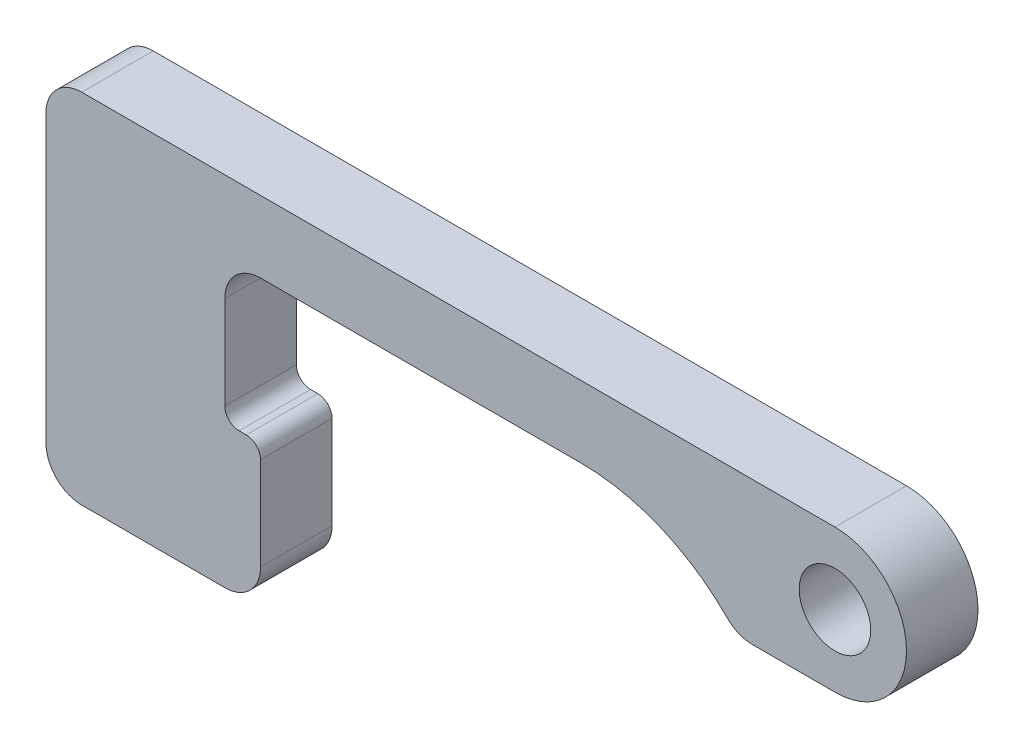
ISO-10303-21;
HEADER;
FILE_DESCRIPTION(('STEP AP214'),'2;1');
FILE_NAME('part.step','',(''),(''),'','','');
FILE_SCHEMA(('AUTOMOTIVE_DESIGN { 1 0 10303 214 1 1 1 1 }'));
ENDSEC;
DATA;
#1=APPLICATION_CONTEXT('core data for automotive mechanical design processes');
#2=APPLICATION_PROTOCOL_DEFINITION('international standard','automotive_design',2000,#1);
#3=PRODUCT_CONTEXT('',#1,'mechanical');
#4=PRODUCT('Part','Part','',(#3));
#5=PRODUCT_RELATED_PRODUCT_CATEGORY('part','',(#4));
#6=PRODUCT_DEFINITION_FORMATION('','',#4);
#7=PRODUCT_DEFINITION_CONTEXT('part definition',#1,'design');
#8=PRODUCT_DEFINITION('design','',#6,#7);
#9=PRODUCT_DEFINITION_SHAPE('','',#8);
#10=(LENGTH_UNIT() NAMED_UNIT(*) SI_UNIT(.MILLI.,.METRE.));
#11=(NAMED_UNIT(*) PLANE_ANGLE_UNIT() SI_UNIT($,.RADIAN.));
#12=(NAMED_UNIT(*) SI_UNIT($,.STERADIAN.) SOLID_ANGLE_UNIT());
#13=UNCERTAINTY_MEASURE_WITH_UNIT(LENGTH_MEASURE(1.E-05),#10,'distance_accuracy_value','');
#14=(GEOMETRIC_REPRESENTATION_CONTEXT(3) GLOBAL_UNCERTAINTY_ASSIGNED_CONTEXT((#13)) GLOBAL_UNIT_ASSIGNED_CONTEXT((#10,
#11,#12)) REPRESENTATION_CONTEXT('',''));
#15=CARTESIAN_POINT('',(0.,0.,0.));
#16=DIRECTION('',(0.,0.,1.));
#17=DIRECTION('',(1.,0.,0.));
#18=AXIS2_PLACEMENT_3D('',#15,#16,#17);
#19=CARTESIAN_POINT('',(0.,0.,-10.));
#20=DIRECTION('',(0.,0.,-1.));
#21=DIRECTION('',(1.,0.,0.));
#22=AXIS2_PLACEMENT_3D('',#19,#20,#21);
#23=PLANE('',#22);
#24=DIRECTION('',(0.,1.,0.));
#25=VECTOR('',#24,1.);
#26=CARTESIAN_POINT('',(-80.3169457006491,-20.,-10.));
#27=LINE('',#26,#25);
#28=CARTESIAN_POINT('',(-80.3169457006491,-35.,-10.));
#29=VERTEX_POINT('',#28);
#30=CARTESIAN_POINT('',(-80.3169457006491,-22.,-10.));
#31=VERTEX_POINT('',#30);
#32=EDGE_CURVE('E232',#29,#31,#27,.T.);
#33=ORIENTED_EDGE('',*,*,#32,.F.);
#34=CARTESIAN_POINT('',(-85.3169457006491,-35.,-10.));
#35=DIRECTION('',(0.,0.,1.));
#36=DIRECTION('',(1.,0.,0.));
#37=AXIS2_PLACEMENT_3D('',#34,#35,#36);
#38=CIRCLE('',#37,5.);
#39=CARTESIAN_POINT('',(-85.3169457006491,-40.,-10.));
#40=VERTEX_POINT('',#39);
#41=EDGE_CURVE('E257',#40,#29,#38,.T.);
#42=ORIENTED_EDGE('',*,*,#41,.F.);
#43=DIRECTION('',(1.,0.,0.));
#44=VECTOR('',#43,1.);
#45=CARTESIAN_POINT('',(-80.3169457006491,-40.,-10.));
#46=LINE('',#45,#44);
#47=CARTESIAN_POINT('',(-105.316945700649,-40.,-10.));
#48=VERTEX_POINT('',#47);
#49=EDGE_CURVE('E200',#48,#40,#46,.T.);
#50=ORIENTED_EDGE('',*,*,#49,.F.);
#51=CARTESIAN_POINT('',(-105.316945700649,-35.,-10.));
#52=DIRECTION('',(0.,0.,1.));
#53=DIRECTION('',(1.,0.,0.));
#54=AXIS2_PLACEMENT_3D('',#51,#52,#53);
#55=CIRCLE('',#54,5.);
#56=CARTESIAN_POINT('',(-110.316945700649,-35.,-10.));
#57=VERTEX_POINT('',#56);
#58=EDGE_CURVE('E254',#57,#48,#55,.T.);
#59=ORIENTED_EDGE('',*,*,#58,.F.);
#60=DIRECTION('',(0.,-1.,0.));
#61=VECTOR('',#60,1.);
#62=CARTESIAN_POINT('',(-110.316945700649,-40.,-10.));
#63=LINE('',#62,#61);
#64=CARTESIAN_POINT('',(-110.316945700649,4.99999999999999,-10.));
#65=VERTEX_POINT('',#64);
#66=EDGE_CURVE('E197',#65,#57,#63,.T.);
#67=ORIENTED_EDGE('',*,*,#66,.F.);
#68=CARTESIAN_POINT('',(-105.316945700649,5.,-10.));
#69=DIRECTION('',(0.,0.,1.));
#70=DIRECTION('',(1.,0.,0.));
#71=AXIS2_PLACEMENT_3D('',#68,#69,#70);
#72=CIRCLE('',#71,5.);
#73=CARTESIAN_POINT('',(-105.316945700649,10.,-10.));
#74=VERTEX_POINT('',#73);
#75=EDGE_CURVE('E260',#74,#65,#72,.T.);
#76=ORIENTED_EDGE('',*,*,#75,.F.);
#77=DIRECTION('',(-1.,0.,0.));
#78=VECTOR('',#77,1.);
#79=CARTESIAN_POINT('',(-110.316945700649,10.,-10.));
#80=LINE('',#79,#78);
#81=CARTESIAN_POINT('',(0.,10.,-10.));
#82=VERTEX_POINT('',#81);
#83=EDGE_CURVE('E194',#82,#74,#80,.T.);
#84=ORIENTED_EDGE('',*,*,#83,.F.);
#85=CARTESIAN_POINT('',(0.,0.,-10.));
#86=DIRECTION('',(0.,0.,1.));
#87=DIRECTION('',(1.,0.,0.));
#88=AXIS2_PLACEMENT_3D('',#85,#86,#87);
#89=CIRCLE('',#88,10.);
#90=CARTESIAN_POINT('',(0.,-10.,-10.));
#91=VERTEX_POINT('',#90);
#92=EDGE_CURVE('E188',#91,#82,#89,.T.);
#93=ORIENTED_EDGE('',*,*,#92,.F.);
#94=DIRECTION('',(1.,0.,0.));
#95=VECTOR('',#94,1.);
#96=CARTESIAN_POINT('',(0.,-10.,-10.));
#97=LINE('',#96,#95);
#98=CARTESIAN_POINT('',(-11.5243555424344,-10.,-10.));
#99=VERTEX_POINT('',#98);
#100=EDGE_CURVE('E185',#99,#91,#97,.T.);
#101=ORIENTED_EDGE('',*,*,#100,.F.);
#102=CARTESIAN_POINT('',(-11.5243555424344,-5.,-10.));
#103=DIRECTION('',(0.,0.,1.));
#104=DIRECTION('',(1.,0.,0.));
#105=AXIS2_PLACEMENT_3D('',#102,#103,#104);
#106=CIRCLE('',#105,5.);
#107=CARTESIAN_POINT('',(-15.0715952576336,-8.52378921090821,-10.));
#108=VERTEX_POINT('',#107);
#109=EDGE_CURVE('E184',#108,#99,#106,.T.);
#110=ORIENTED_EDGE('',*,*,#109,.F.);
#111=CARTESIAN_POINT('',(-35.5537132832868,-28.8705016718932,-10.));
#112=DIRECTION('',(0.,0.,-1.));
#113=DIRECTION('',(1.,0.,0.));
#114=AXIS2_PLACEMENT_3D('',#111,#112,#113);
#115=CIRCLE('',#114,28.8705016718932);
#116=CARTESIAN_POINT('',(-35.5537132832868,0.,-10.));
#117=VERTEX_POINT('',#116);
#118=EDGE_CURVE('E162',#117,#108,#115,.T.);
#119=ORIENTED_EDGE('',*,*,#118,.F.);
#120=DIRECTION('',(1.,0.,0.));
#121=VECTOR('',#120,1.);
#122=CARTESIAN_POINT('',(-85.3169457006491,0.,-10.));
#123=LINE('',#122,#121);
#124=CARTESIAN_POINT('',(-80.3169457006491,0.,-10.));
#125=VERTEX_POINT('',#124);
#126=EDGE_CURVE('E173',#125,#117,#123,.T.);
#127=ORIENTED_EDGE('',*,*,#126,.F.);
#128=CARTESIAN_POINT('',(-80.3169457006491,-4.99999999999999,-10.));
#129=DIRECTION('',(0.,0.,1.));
#130=DIRECTION('',(1.,0.,0.));
#131=AXIS2_PLACEMENT_3D('',#128,#129,#130);
#132=CIRCLE('',#131,5.);
#133=CARTESIAN_POINT('',(-85.3169457006491,-4.99999999999999,-10.));
#134=VERTEX_POINT('',#133);
#135=EDGE_CURVE('E279',#134,#125,#132,.F.);
#136=ORIENTED_EDGE('',*,*,#135,.F.);
#137=DIRECTION('',(0.,1.,0.));
#138=VECTOR('',#137,1.);
#139=CARTESIAN_POINT('',(-85.3169457006491,0.,-10.));
#140=LINE('',#139,#138);
#141=CARTESIAN_POINT('',(-85.3169457006491,-18.,-10.));
#142=VERTEX_POINT('',#141);
#143=EDGE_CURVE('E178',#142,#134,#140,.T.);
#144=ORIENTED_EDGE('',*,*,#143,.F.);
#145=CARTESIAN_POINT('',(-83.3169457006491,-18.,-10.));
#146=DIRECTION('',(0.,0.,1.));
#147=DIRECTION('',(1.,0.,0.));
#148=AXIS2_PLACEMENT_3D('',#145,#146,#147);
#149=CIRCLE('',#148,2.);
#150=CARTESIAN_POINT('',(-83.3169457006491,-20.,-10.));
#151=VERTEX_POINT('',#150);
#152=EDGE_CURVE('E11',#151,#142,#149,.F.);
#153=ORIENTED_EDGE('',*,*,#152,.F.);
#154=DIRECTION('',(-1.,0.,0.));
#155=VECTOR('',#154,1.);
#156=CARTESIAN_POINT('',(-85.3169457006491,-20.,-10.));
#157=LINE('',#156,#155);
#158=CARTESIAN_POINT('',(-82.3169457006491,-20.,-10.));
#159=VERTEX_POINT('',#158);
#160=EDGE_CURVE('E305',#159,#151,#157,.T.);
#161=ORIENTED_EDGE('',*,*,#160,.F.);
#162=CARTESIAN_POINT('',(-82.3169457006491,-22.,-10.));
#163=DIRECTION('',(0.,0.,1.));
#164=DIRECTION('',(1.,0.,0.));
#165=AXIS2_PLACEMENT_3D('',#162,#163,#164);
#166=CIRCLE('',#165,2.);
#167=EDGE_CURVE('E290',#31,#159,#166,.T.);
#168=ORIENTED_EDGE('',*,*,#167,.F.);
#169=EDGE_LOOP('',(#33,#42,#50,#59,#67,#76,#84,#93,#101,#110,#119,#127,#136,#144,#153,#161,#168));
#170=FACE_BOUND('',#169,.T.);
#171=CARTESIAN_POINT('',(0.,0.,-10.));
#172=DIRECTION('',(0.,0.,1.));
#173=DIRECTION('',(1.,0.,0.));
#174=AXIS2_PLACEMENT_3D('',#171,#172,#173);
#175=CIRCLE('',#174,4.99999999999999);
#176=CARTESIAN_POINT('',(4.99999999999999,0.,-10.));
#177=VERTEX_POINT('',#176);
#178=EDGE_CURVE('E208',#177,#177,#175,.T.);
#179=ORIENTED_EDGE('',*,*,#178,.T.);
#180=EDGE_LOOP('',(#179));
#181=FACE_BOUND('',#180,.T.);
#182=ADVANCED_FACE('F39',(#170,#181),#23,.T.);
#183=CARTESIAN_POINT('',(0.,0.,0.));
#184=DIRECTION('',(0.,0.,-1.));
#185=DIRECTION('',(1.,0.,0.));
#186=AXIS2_PLACEMENT_3D('',#183,#184,#185);
#187=PLANE('',#186);
#188=DIRECTION('',(-1.,0.,0.));
#189=VECTOR('',#188,1.);
#190=CARTESIAN_POINT('',(-85.3169457006491,-20.,0.));
#191=LINE('',#190,#189);
#192=CARTESIAN_POINT('',(-82.3169457006491,-20.,0.));
#193=VERTEX_POINT('',#192);
#194=CARTESIAN_POINT('',(-83.3169457006491,-20.,0.));
#195=VERTEX_POINT('',#194);
#196=EDGE_CURVE('E207',#193,#195,#191,.T.);
#197=ORIENTED_EDGE('',*,*,#196,.T.);
#198=CARTESIAN_POINT('',(-83.3169457006491,-18.,0.));
#199=DIRECTION('',(0.,0.,1.));
#200=DIRECTION('',(1.,0.,0.));
#201=AXIS2_PLACEMENT_3D('',#198,#199,#200);
#202=CIRCLE('',#201,2.);
#203=CARTESIAN_POINT('',(-85.3169457006491,-18.,0.));
#204=VERTEX_POINT('',#203);
#205=EDGE_CURVE('E47',#204,#195,#202,.T.);
#206=ORIENTED_EDGE('',*,*,#205,.F.);
#207=DIRECTION('',(0.,1.,0.));
#208=VECTOR('',#207,1.);
#209=CARTESIAN_POINT('',(-85.3169457006491,0.,0.));
#210=LINE('',#209,#208);
#211=CARTESIAN_POINT('',(-85.3169457006491,-4.99999999999999,0.));
#212=VERTEX_POINT('',#211);
#213=EDGE_CURVE('E211',#204,#212,#210,.T.);
#214=ORIENTED_EDGE('',*,*,#213,.T.);
#215=CARTESIAN_POINT('',(-80.3169457006491,-4.99999999999999,0.));
#216=DIRECTION('',(0.,0.,1.));
#217=DIRECTION('',(1.,0.,0.));
#218=AXIS2_PLACEMENT_3D('',#215,#216,#217);
#219=CIRCLE('',#218,5.);
#220=CARTESIAN_POINT('',(-80.3169457006491,0.,0.));
#221=VERTEX_POINT('',#220);
#222=EDGE_CURVE('E276',#221,#212,#219,.T.);
#223=ORIENTED_EDGE('',*,*,#222,.F.);
#224=DIRECTION('',(1.,0.,0.));
#225=VECTOR('',#224,1.);
#226=CARTESIAN_POINT('',(-85.3169457006491,0.,0.));
#227=LINE('',#226,#225);
#228=CARTESIAN_POINT('',(-35.5537132832868,0.,0.));
#229=VERTEX_POINT('',#228);
#230=EDGE_CURVE('E214',#221,#229,#227,.T.);
#231=ORIENTED_EDGE('',*,*,#230,.T.);
#232=CARTESIAN_POINT('',(-35.5537132832868,-28.8705016718932,0.));
#233=DIRECTION('',(0.,0.,-1.));
#234=DIRECTION('',(1.,0.,0.));
#235=AXIS2_PLACEMENT_3D('',#232,#233,#234);
#236=CIRCLE('',#235,28.8705016718932);
#237=CARTESIAN_POINT('',(-15.0715952576336,-8.52378921090821,0.));
#238=VERTEX_POINT('',#237);
#239=EDGE_CURVE('E165',#229,#238,#236,.T.);
#240=ORIENTED_EDGE('',*,*,#239,.T.);
#241=CARTESIAN_POINT('',(-11.5243555424344,-5.,0.));
#242=DIRECTION('',(0.,0.,1.));
#243=DIRECTION('',(1.,0.,0.));
#244=AXIS2_PLACEMENT_3D('',#241,#242,#243);
#245=CIRCLE('',#244,5.);
#246=CARTESIAN_POINT('',(-11.5243555424344,-10.,0.));
#247=VERTEX_POINT('',#246);
#248=EDGE_CURVE('E249',#247,#238,#245,.F.);
#249=ORIENTED_EDGE('',*,*,#248,.F.);
#250=DIRECTION('',(1.,0.,0.));
#251=VECTOR('',#250,1.);
#252=CARTESIAN_POINT('',(0.,-10.,0.));
#253=LINE('',#252,#251);
#254=CARTESIAN_POINT('',(0.,-10.,0.));
#255=VERTEX_POINT('',#254);
#256=EDGE_CURVE('E217',#247,#255,#253,.T.);
#257=ORIENTED_EDGE('',*,*,#256,.T.);
#258=CARTESIAN_POINT('',(0.,0.,0.));
#259=DIRECTION('',(0.,0.,1.));
#260=DIRECTION('',(1.,0.,0.));
#261=AXIS2_PLACEMENT_3D('',#258,#259,#260);
#262=CIRCLE('',#261,10.);
#263=CARTESIAN_POINT('',(0.,10.,0.));
#264=VERTEX_POINT('',#263);
#265=EDGE_CURVE('E220',#255,#264,#262,.T.);
#266=ORIENTED_EDGE('',*,*,#265,.T.);
#267=DIRECTION('',(-1.,0.,0.));
#268=VECTOR('',#267,1.);
#269=CARTESIAN_POINT('',(-110.316945700649,10.,0.));
#270=LINE('',#269,#268);
#271=CARTESIAN_POINT('',(-105.316945700649,10.,0.));
#272=VERTEX_POINT('',#271);
#273=EDGE_CURVE('E223',#264,#272,#270,.T.);
#274=ORIENTED_EDGE('',*,*,#273,.T.);
#275=CARTESIAN_POINT('',(-105.316945700649,5.,0.));
#276=DIRECTION('',(0.,0.,1.));
#277=DIRECTION('',(1.,0.,0.));
#278=AXIS2_PLACEMENT_3D('',#275,#276,#277);
#279=CIRCLE('',#278,5.);
#280=CARTESIAN_POINT('',(-110.316945700649,4.99999999999999,0.));
#281=VERTEX_POINT('',#280);
#282=EDGE_CURVE('E246',#281,#272,#279,.F.);
#283=ORIENTED_EDGE('',*,*,#282,.F.);
#284=DIRECTION('',(0.,-1.,0.));
#285=VECTOR('',#284,1.);
#286=CARTESIAN_POINT('',(-110.316945700649,-40.,0.));
#287=LINE('',#286,#285);
#288=CARTESIAN_POINT('',(-110.316945700649,-35.,0.));
#289=VERTEX_POINT('',#288);
#290=EDGE_CURVE('E226',#281,#289,#287,.T.);
#291=ORIENTED_EDGE('',*,*,#290,.T.);
#292=CARTESIAN_POINT('',(-105.316945700649,-35.,0.));
#293=DIRECTION('',(0.,0.,1.));
#294=DIRECTION('',(1.,0.,0.));
#295=AXIS2_PLACEMENT_3D('',#292,#293,#294);
#296=CIRCLE('',#295,5.);
#297=CARTESIAN_POINT('',(-105.316945700649,-40.,0.));
#298=VERTEX_POINT('',#297);
#299=EDGE_CURVE('E240',#298,#289,#296,.F.);
#300=ORIENTED_EDGE('',*,*,#299,.F.);
#301=DIRECTION('',(1.,0.,0.));
#302=VECTOR('',#301,1.);
#303=CARTESIAN_POINT('',(-80.3169457006491,-40.,0.));
#304=LINE('',#303,#302);
#305=CARTESIAN_POINT('',(-85.3169457006491,-40.,0.));
#306=VERTEX_POINT('',#305);
#307=EDGE_CURVE('E229',#298,#306,#304,.T.);
#308=ORIENTED_EDGE('',*,*,#307,.T.);
#309=CARTESIAN_POINT('',(-85.3169457006491,-35.,0.));
#310=DIRECTION('',(0.,0.,1.));
#311=DIRECTION('',(1.,0.,0.));
#312=AXIS2_PLACEMENT_3D('',#309,#310,#311);
#313=CIRCLE('',#312,5.);
#314=CARTESIAN_POINT('',(-80.3169457006491,-35.,0.));
#315=VERTEX_POINT('',#314);
#316=EDGE_CURVE('E243',#315,#306,#313,.F.);
#317=ORIENTED_EDGE('',*,*,#316,.F.);
#318=DIRECTION('',(0.,1.,0.));
#319=VECTOR('',#318,1.);
#320=CARTESIAN_POINT('',(-80.3169457006491,-20.,0.));
#321=LINE('',#320,#319);
#322=CARTESIAN_POINT('',(-80.3169457006491,-22.,0.));
#323=VERTEX_POINT('',#322);
#324=EDGE_CURVE('E204',#315,#323,#321,.T.);
#325=ORIENTED_EDGE('',*,*,#324,.T.);
#326=CARTESIAN_POINT('',(-82.3169457006491,-22.,0.));
#327=DIRECTION('',(0.,0.,1.));
#328=DIRECTION('',(1.,0.,0.));
#329=AXIS2_PLACEMENT_3D('',#326,#327,#328);
#330=CIRCLE('',#329,2.);
#331=EDGE_CURVE('E287',#193,#323,#330,.F.);
#332=ORIENTED_EDGE('',*,*,#331,.F.);
#333=EDGE_LOOP('',(#197,#206,#214,#223,#231,#240,#249,#257,#266,#274,#283,#291,#300,#308,#317,
#325,#332));
#334=FACE_BOUND('',#333,.T.);
#335=CARTESIAN_POINT('',(0.,0.,0.));
#336=DIRECTION('',(0.,0.,1.));
#337=DIRECTION('',(1.,0.,0.));
#338=AXIS2_PLACEMENT_3D('',#335,#336,#337);
#339=CIRCLE('',#338,4.99999999999999);
#340=CARTESIAN_POINT('',(4.99999999999999,0.,0.));
#341=VERTEX_POINT('',#340);
#342=EDGE_CURVE('E313',#341,#341,#339,.T.);
#343=ORIENTED_EDGE('',*,*,#342,.F.);
#344=EDGE_LOOP('',(#343));
#345=FACE_BOUND('',#344,.T.);
#346=ADVANCED_FACE('F300',(#334,#345),#187,.F.);
#347=CARTESIAN_POINT('',(-80.3169457006491,-20.,-10.));
#348=DIRECTION('',(-1.,0.,0.));
#349=DIRECTION('',(0.,0.,-1.));
#350=AXIS2_PLACEMENT_3D('',#347,#348,#349);
#351=PLANE('',#350);
#352=ORIENTED_EDGE('',*,*,#324,.F.);
#353=DIRECTION('',(0.,0.,1.));
#354=VECTOR('',#353,1.);
#355=CARTESIAN_POINT('',(-80.3169457006491,-35.,-10.));
#356=LINE('',#355,#354);
#357=EDGE_CURVE('E270',#29,#315,#356,.T.);
#358=ORIENTED_EDGE('',*,*,#357,.F.);
#359=ORIENTED_EDGE('',*,*,#32,.T.);
#360=DIRECTION('',(0.,0.,1.));
#361=VECTOR('',#360,1.);
#362=CARTESIAN_POINT('',(-80.3169457006491,-22.,-10.));
#363=LINE('',#362,#361);
#364=EDGE_CURVE('E54',#323,#31,#363,.F.);
#365=ORIENTED_EDGE('',*,*,#364,.F.);
#366=EDGE_LOOP('',(#352,#358,#359,#365));
#367=FACE_BOUND('',#366,.T.);
#368=ADVANCED_FACE('F327',(#367),#351,.F.);
#369=CARTESIAN_POINT('',(-85.3169457006491,-20.,-10.));
#370=DIRECTION('',(0.,-1.,0.));
#371=DIRECTION('',(0.,0.,1.));
#372=AXIS2_PLACEMENT_3D('',#369,#370,#371);
#373=PLANE('',#372);
#374=ORIENTED_EDGE('',*,*,#196,.F.);
#375=DIRECTION('',(0.,0.,1.));
#376=VECTOR('',#375,1.);
#377=CARTESIAN_POINT('',(-82.3169457006491,-20.,-10.));
#378=LINE('',#377,#376);
#379=EDGE_CURVE('E283',#159,#193,#378,.T.);
#380=ORIENTED_EDGE('',*,*,#379,.F.);
#381=ORIENTED_EDGE('',*,*,#160,.T.);
#382=DIRECTION('',(0.,0.,1.));
#383=VECTOR('',#382,1.);
#384=CARTESIAN_POINT('',(-83.3169457006491,-20.,-10.));
#385=LINE('',#384,#383);
#386=EDGE_CURVE('E285',#195,#151,#385,.F.);
#387=ORIENTED_EDGE('',*,*,#386,.F.);
#388=EDGE_LOOP('',(#374,#380,#381,#387));
#389=FACE_BOUND('',#388,.T.);
#390=ADVANCED_FACE('F303',(#389),#373,.F.);
#391=CARTESIAN_POINT('',(-85.3169457006491,0.,-10.));
#392=DIRECTION('',(-1.,0.,0.));
#393=DIRECTION('',(0.,0.,-1.));
#394=AXIS2_PLACEMENT_3D('',#391,#392,#393);
#395=PLANE('',#394);
#396=ORIENTED_EDGE('',*,*,#143,.T.);
#397=DIRECTION('',(0.,0.,1.));
#398=VECTOR('',#397,1.);
#399=CARTESIAN_POINT('',(-85.3169457006491,-4.99999999999999,-10.));
#400=LINE('',#399,#398);
#401=EDGE_CURVE('E236',#212,#134,#400,.F.);
#402=ORIENTED_EDGE('',*,*,#401,.F.);
#403=ORIENTED_EDGE('',*,*,#213,.F.);
#404=DIRECTION('',(0.,0.,1.));
#405=VECTOR('',#404,1.);
#406=CARTESIAN_POINT('',(-85.3169457006491,-18.,0.));
#407=LINE('',#406,#405);
#408=EDGE_CURVE('E281',#142,#204,#407,.T.);
#409=ORIENTED_EDGE('',*,*,#408,.F.);
#410=EDGE_LOOP('',(#396,#402,#403,#409));
#411=FACE_BOUND('',#410,.T.);
#412=ADVANCED_FACE('F359',(#411),#395,.F.);
#413=CARTESIAN_POINT('',(-85.3169457006491,0.,-10.));
#414=DIRECTION('',(0.,1.,0.));
#415=DIRECTION('',(0.,0.,-1.));
#416=AXIS2_PLACEMENT_3D('',#413,#414,#415);
#417=PLANE('',#416);
#418=ORIENTED_EDGE('',*,*,#126,.T.);
#419=DIRECTION('',(0.,0.,1.));
#420=VECTOR('',#419,1.);
#421=CARTESIAN_POINT('',(-35.5537132832868,0.,-10.));
#422=LINE('',#421,#420);
#423=EDGE_CURVE('E158',#117,#229,#422,.T.);
#424=ORIENTED_EDGE('',*,*,#423,.T.);
#425=ORIENTED_EDGE('',*,*,#230,.F.);
#426=DIRECTION('',(0.,0.,1.));
#427=VECTOR('',#426,1.);
#428=CARTESIAN_POINT('',(-80.3169457006491,0.,0.));
#429=LINE('',#428,#427);
#430=EDGE_CURVE('E169',#125,#221,#429,.T.);
#431=ORIENTED_EDGE('',*,*,#430,.F.);
#432=EDGE_LOOP('',(#418,#424,#425,#431));
#433=FACE_BOUND('',#432,.T.);
#434=ADVANCED_FACE('F174',(#433),#417,.F.);
#435=CARTESIAN_POINT('',(-35.5537132832868,-28.8705016718932,-10.));
#436=DIRECTION('',(0.,0.,1.));
#437=DIRECTION('',(-1.,0.,0.));
#438=AXIS2_PLACEMENT_3D('',#435,#436,#437);
#439=CYLINDRICAL_SURFACE('',#438,28.8705016718932);
#440=ORIENTED_EDGE('',*,*,#239,.F.);
#441=ORIENTED_EDGE('',*,*,#423,.F.);
#442=ORIENTED_EDGE('',*,*,#118,.T.);
#443=DIRECTION('',(0.,0.,1.));
#444=VECTOR('',#443,1.);
#445=CARTESIAN_POINT('',(-15.0715952576336,-8.52378921090822,-10.));
#446=LINE('',#445,#444);
#447=EDGE_CURVE('E252',#238,#108,#446,.F.);
#448=ORIENTED_EDGE('',*,*,#447,.F.);
#449=EDGE_LOOP('',(#440,#441,#442,#448));
#450=FACE_BOUND('',#449,.T.);
#451=ADVANCED_FACE('F160',(#450),#439,.F.);
#452=CARTESIAN_POINT('',(0.,-10.,-10.));
#453=DIRECTION('',(0.,1.,0.));
#454=DIRECTION('',(0.,0.,-1.));
#455=AXIS2_PLACEMENT_3D('',#452,#453,#454);
#456=PLANE('',#455);
#457=ORIENTED_EDGE('',*,*,#100,.T.);
#458=DIRECTION('',(0.,0.,1.));
#459=VECTOR('',#458,1.);
#460=CARTESIAN_POINT('',(0.,-10.,-10.));
#461=LINE('',#460,#459);
#462=EDGE_CURVE('E170',#91,#255,#461,.T.);
#463=ORIENTED_EDGE('',*,*,#462,.T.);
#464=ORIENTED_EDGE('',*,*,#256,.F.);
#465=DIRECTION('',(0.,0.,1.));
#466=VECTOR('',#465,1.);
#467=CARTESIAN_POINT('',(-11.5243555424344,-10.,-10.));
#468=LINE('',#467,#466);
#469=EDGE_CURVE('E238',#99,#247,#468,.T.);
#470=ORIENTED_EDGE('',*,*,#469,.F.);
#471=EDGE_LOOP('',(#457,#463,#464,#470));
#472=FACE_BOUND('',#471,.T.);
#473=ADVANCED_FACE('F350',(#472),#456,.F.);
#474=CARTESIAN_POINT('',(0.,0.,-10.));
#475=DIRECTION('',(0.,0.,1.));
#476=DIRECTION('',(-1.,0.,0.));
#477=AXIS2_PLACEMENT_3D('',#474,#475,#476);
#478=CYLINDRICAL_SURFACE('',#477,10.);
#479=ORIENTED_EDGE('',*,*,#265,.F.);
#480=ORIENTED_EDGE('',*,*,#462,.F.);
#481=ORIENTED_EDGE('',*,*,#92,.T.);
#482=DIRECTION('',(0.,0.,1.));
#483=VECTOR('',#482,1.);
#484=CARTESIAN_POINT('',(0.,10.,-10.));
#485=LINE('',#484,#483);
#486=EDGE_CURVE('E203',#82,#264,#485,.T.);
#487=ORIENTED_EDGE('',*,*,#486,.T.);
#488=EDGE_LOOP('',(#479,#480,#481,#487));
#489=FACE_BOUND('',#488,.T.);
#490=ADVANCED_FACE('F346',(#489),#478,.T.);
#491=CARTESIAN_POINT('',(-110.316945700649,10.,-10.));
#492=DIRECTION('',(0.,-1.,0.));
#493=DIRECTION('',(0.,0.,1.));
#494=AXIS2_PLACEMENT_3D('',#491,#492,#493);
#495=PLANE('',#494);
#496=ORIENTED_EDGE('',*,*,#273,.F.);
#497=ORIENTED_EDGE('',*,*,#486,.F.);
#498=ORIENTED_EDGE('',*,*,#83,.T.);
#499=DIRECTION('',(0.,0.,1.));
#500=VECTOR('',#499,1.);
#501=CARTESIAN_POINT('',(-105.316945700649,10.,-10.));
#502=LINE('',#501,#500);
#503=EDGE_CURVE('E268',#272,#74,#502,.F.);
#504=ORIENTED_EDGE('',*,*,#503,.F.);
#505=EDGE_LOOP('',(#496,#497,#498,#504));
#506=FACE_BOUND('',#505,.T.);
#507=ADVANCED_FACE('F342',(#506),#495,.F.);
#508=CARTESIAN_POINT('',(-110.316945700649,-40.,-10.));
#509=DIRECTION('',(1.,0.,0.));
#510=DIRECTION('',(0.,0.,1.));
#511=AXIS2_PLACEMENT_3D('',#508,#509,#510);
#512=PLANE('',#511);
#513=ORIENTED_EDGE('',*,*,#66,.T.);
#514=DIRECTION('',(0.,0.,1.));
#515=VECTOR('',#514,1.);
#516=CARTESIAN_POINT('',(-110.316945700649,-35.,-10.));
#517=LINE('',#516,#515);
#518=EDGE_CURVE('E264',#289,#57,#517,.F.);
#519=ORIENTED_EDGE('',*,*,#518,.F.);
#520=ORIENTED_EDGE('',*,*,#290,.F.);
#521=DIRECTION('',(0.,0.,1.));
#522=VECTOR('',#521,1.);
#523=CARTESIAN_POINT('',(-110.316945700649,5.,-10.));
#524=LINE('',#523,#522);
#525=EDGE_CURVE('E266',#65,#281,#524,.T.);
#526=ORIENTED_EDGE('',*,*,#525,.F.);
#527=EDGE_LOOP('',(#513,#519,#520,#526));
#528=FACE_BOUND('',#527,.T.);
#529=ADVANCED_FACE('F338',(#528),#512,.F.);
#530=CARTESIAN_POINT('',(-80.3169457006491,-40.,-10.));
#531=DIRECTION('',(0.,1.,0.));
#532=DIRECTION('',(0.,0.,-1.));
#533=AXIS2_PLACEMENT_3D('',#530,#531,#532);
#534=PLANE('',#533);
#535=ORIENTED_EDGE('',*,*,#307,.F.);
#536=DIRECTION('',(0.,0.,1.));
#537=VECTOR('',#536,1.);
#538=CARTESIAN_POINT('',(-105.316945700649,-40.,-10.));
#539=LINE('',#538,#537);
#540=EDGE_CURVE('E272',#48,#298,#539,.T.);
#541=ORIENTED_EDGE('',*,*,#540,.F.);
#542=ORIENTED_EDGE('',*,*,#49,.T.);
#543=DIRECTION('',(0.,0.,1.));
#544=VECTOR('',#543,1.);
#545=CARTESIAN_POINT('',(-85.3169457006491,-40.,-10.));
#546=LINE('',#545,#544);
#547=EDGE_CURVE('E274',#306,#40,#546,.F.);
#548=ORIENTED_EDGE('',*,*,#547,.F.);
#549=EDGE_LOOP('',(#535,#541,#542,#548));
#550=FACE_BOUND('',#549,.T.);
#551=ADVANCED_FACE('F323',(#550),#534,.F.);
#552=CARTESIAN_POINT('',(0.,0.,-10.));
#553=DIRECTION('',(0.,0.,1.));
#554=DIRECTION('',(-1.,0.,0.));
#555=AXIS2_PLACEMENT_3D('',#552,#553,#554);
#556=CYLINDRICAL_SURFACE('',#555,4.99999999999999);
#557=ORIENTED_EDGE('',*,*,#178,.F.);
#558=EDGE_LOOP('',(#557));
#559=FACE_BOUND('',#558,.T.);
#560=ORIENTED_EDGE('',*,*,#342,.T.);
#561=EDGE_LOOP('',(#560));
#562=FACE_BOUND('',#561,.T.);
#563=ADVANCED_FACE('F319',(#559,#562),#556,.F.);
#564=CARTESIAN_POINT('',(-80.3169457006491,-4.99999999999999,-10.));
#565=DIRECTION('',(0.,0.,-1.));
#566=DIRECTION('',(1.,0.,0.));
#567=AXIS2_PLACEMENT_3D('',#564,#565,#566);
#568=CYLINDRICAL_SURFACE('',#567,5.);
#569=ORIENTED_EDGE('',*,*,#135,.T.);
#570=ORIENTED_EDGE('',*,*,#430,.T.);
#571=ORIENTED_EDGE('',*,*,#222,.T.);
#572=ORIENTED_EDGE('',*,*,#401,.T.);
#573=EDGE_LOOP('',(#569,#570,#571,#572));
#574=FACE_BOUND('',#573,.T.);
#575=ADVANCED_FACE('F322',(#574),#568,.F.);
#576=CARTESIAN_POINT('',(-11.5243555424344,-5.,-10.));
#577=DIRECTION('',(0.,0.,1.));
#578=DIRECTION('',(-1.,0.,0.));
#579=AXIS2_PLACEMENT_3D('',#576,#577,#578);
#580=CYLINDRICAL_SURFACE('',#579,5.);
#581=ORIENTED_EDGE('',*,*,#109,.T.);
#582=ORIENTED_EDGE('',*,*,#469,.T.);
#583=ORIENTED_EDGE('',*,*,#248,.T.);
#584=ORIENTED_EDGE('',*,*,#447,.T.);
#585=EDGE_LOOP('',(#581,#582,#583,#584));
#586=FACE_BOUND('',#585,.T.);
#587=ADVANCED_FACE('F366',(#586),#580,.T.);
#588=CARTESIAN_POINT('',(-105.316945700649,5.,-10.));
#589=DIRECTION('',(0.,0.,1.));
#590=DIRECTION('',(-1.,0.,0.));
#591=AXIS2_PLACEMENT_3D('',#588,#589,#590);
#592=CYLINDRICAL_SURFACE('',#591,5.);
#593=ORIENTED_EDGE('',*,*,#75,.T.);
#594=ORIENTED_EDGE('',*,*,#525,.T.);
#595=ORIENTED_EDGE('',*,*,#282,.T.);
#596=ORIENTED_EDGE('',*,*,#503,.T.);
#597=EDGE_LOOP('',(#593,#594,#595,#596));
#598=FACE_BOUND('',#597,.T.);
#599=ADVANCED_FACE('F370',(#598),#592,.T.);
#600=CARTESIAN_POINT('',(-85.3169457006491,-35.,-10.));
#601=DIRECTION('',(0.,0.,1.));
#602=DIRECTION('',(-1.,0.,0.));
#603=AXIS2_PLACEMENT_3D('',#600,#601,#602);
#604=CYLINDRICAL_SURFACE('',#603,5.);
#605=ORIENTED_EDGE('',*,*,#41,.T.);
#606=ORIENTED_EDGE('',*,*,#357,.T.);
#607=ORIENTED_EDGE('',*,*,#316,.T.);
#608=ORIENTED_EDGE('',*,*,#547,.T.);
#609=EDGE_LOOP('',(#605,#606,#607,#608));
#610=FACE_BOUND('',#609,.T.);
#611=ADVANCED_FACE('F374',(#610),#604,.T.);
#612=CARTESIAN_POINT('',(-105.316945700649,-35.,-10.));
#613=DIRECTION('',(0.,0.,1.));
#614=DIRECTION('',(-1.,0.,0.));
#615=AXIS2_PLACEMENT_3D('',#612,#613,#614);
#616=CYLINDRICAL_SURFACE('',#615,5.);
#617=ORIENTED_EDGE('',*,*,#58,.T.);
#618=ORIENTED_EDGE('',*,*,#540,.T.);
#619=ORIENTED_EDGE('',*,*,#299,.T.);
#620=ORIENTED_EDGE('',*,*,#518,.T.);
#621=EDGE_LOOP('',(#617,#618,#619,#620));
#622=FACE_BOUND('',#621,.T.);
#623=ADVANCED_FACE('F378',(#622),#616,.T.);
#624=CARTESIAN_POINT('',(-83.3169457006491,-18.,-10.));
#625=DIRECTION('',(0.,0.,-1.));
#626=DIRECTION('',(1.,0.,0.));
#627=AXIS2_PLACEMENT_3D('',#624,#625,#626);
#628=CYLINDRICAL_SURFACE('',#627,2.);
#629=ORIENTED_EDGE('',*,*,#152,.T.);
#630=ORIENTED_EDGE('',*,*,#408,.T.);
#631=ORIENTED_EDGE('',*,*,#205,.T.);
#632=ORIENTED_EDGE('',*,*,#386,.T.);
#633=EDGE_LOOP('',(#629,#630,#631,#632));
#634=FACE_BOUND('',#633,.T.);
#635=ADVANCED_FACE('F294',(#634),#628,.F.);
#636=CARTESIAN_POINT('',(-82.3169457006491,-22.,-10.));
#637=DIRECTION('',(0.,0.,1.));
#638=DIRECTION('',(-1.,0.,0.));
#639=AXIS2_PLACEMENT_3D('',#636,#637,#638);
#640=CYLINDRICAL_SURFACE('',#639,2.);
#641=ORIENTED_EDGE('',*,*,#167,.T.);
#642=ORIENTED_EDGE('',*,*,#379,.T.);
#643=ORIENTED_EDGE('',*,*,#331,.T.);
#644=ORIENTED_EDGE('',*,*,#364,.T.);
#645=EDGE_LOOP('',(#641,#642,#643,#644));
#646=FACE_BOUND('',#645,.T.);
#647=ADVANCED_FACE('F41',(#646),#640,.T.);
#648=CLOSED_SHELL('',(#182,#346,#368,#390,#412,#434,#451,#473,#490,#507,#529,#551,#563,#575,
#587,#599,#611,#623,#635,#647));
#649=MANIFOLD_SOLID_BREP('B2',#648);
#650=ADVANCED_BREP_SHAPE_REPRESENTATION('',(#18,#649),#14);
#651=SHAPE_DEFINITION_REPRESENTATION(#9,#650);
ENDSEC;
END-ISO-10303-21;
